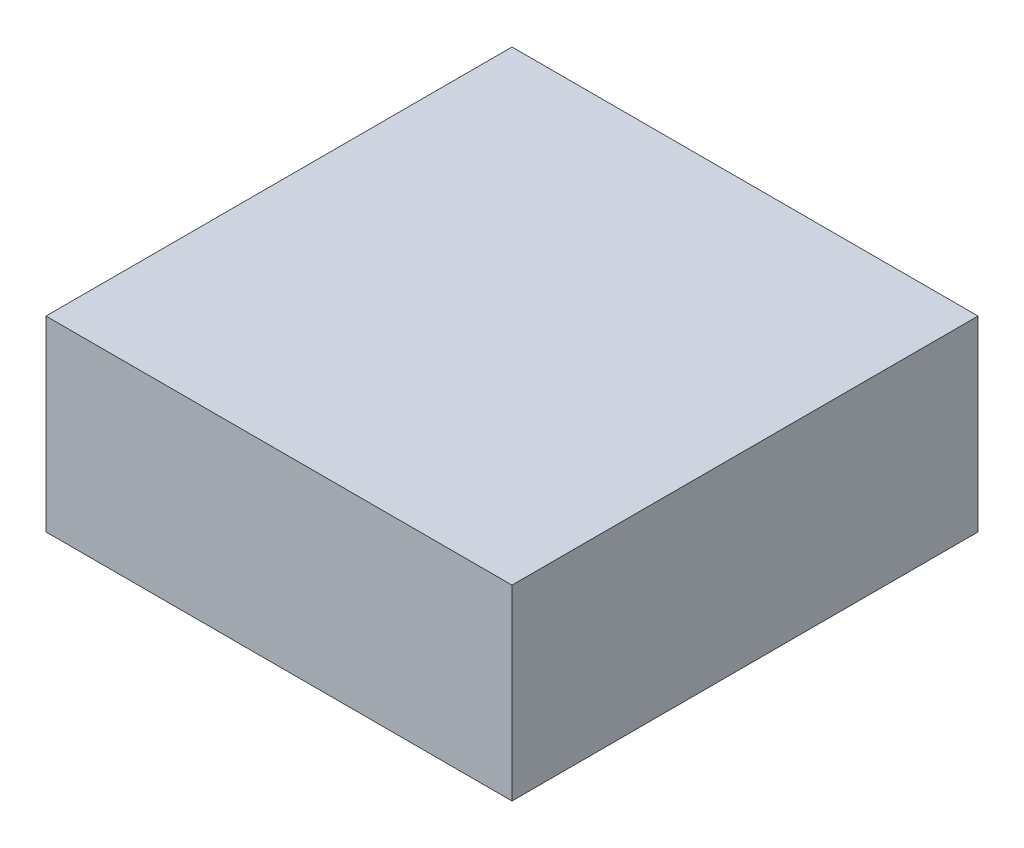
ISO-10303-21;
HEADER;
FILE_DESCRIPTION(('STEP AP214'),'2;1');
FILE_NAME('part.step','',(''),(''),'','','');
FILE_SCHEMA(('AUTOMOTIVE_DESIGN { 1 0 10303 214 1 1 1 1 }'));
ENDSEC;
DATA;
#1=APPLICATION_CONTEXT('core data for automotive mechanical design processes');
#2=APPLICATION_PROTOCOL_DEFINITION('international standard','automotive_design',2000,#1);
#3=PRODUCT_CONTEXT('',#1,'mechanical');
#4=PRODUCT('Part','Part','',(#3));
#5=PRODUCT_RELATED_PRODUCT_CATEGORY('part','',(#4));
#6=PRODUCT_DEFINITION_FORMATION('','',#4);
#7=PRODUCT_DEFINITION_CONTEXT('part definition',#1,'design');
#8=PRODUCT_DEFINITION('design','',#6,#7);
#9=PRODUCT_DEFINITION_SHAPE('','',#8);
#10=(LENGTH_UNIT() NAMED_UNIT(*) SI_UNIT(.MILLI.,.METRE.));
#11=(NAMED_UNIT(*) PLANE_ANGLE_UNIT() SI_UNIT($,.RADIAN.));
#12=(NAMED_UNIT(*) SI_UNIT($,.STERADIAN.) SOLID_ANGLE_UNIT());
#13=UNCERTAINTY_MEASURE_WITH_UNIT(LENGTH_MEASURE(1.E-05),#10,'distance_accuracy_value','');
#14=(GEOMETRIC_REPRESENTATION_CONTEXT(3) GLOBAL_UNCERTAINTY_ASSIGNED_CONTEXT((#13)) GLOBAL_UNIT_ASSIGNED_CONTEXT((#10,
#11,#12)) REPRESENTATION_CONTEXT('',''));
#15=CARTESIAN_POINT('',(0.,0.,0.));
#16=DIRECTION('',(0.,0.,1.));
#17=DIRECTION('',(1.,0.,0.));
#18=AXIS2_PLACEMENT_3D('',#15,#16,#17);
#19=CARTESIAN_POINT('',(3.925,-3.15,-3.925));
#20=DIRECTION('',(1.,0.,0.));
#21=DIRECTION('',(0.,0.,-1.));
#22=AXIS2_PLACEMENT_3D('',#19,#20,#21);
#23=PLANE('',#22);
#24=DIRECTION('',(0.,0.,-1.));
#25=VECTOR('',#24,1.);
#26=CARTESIAN_POINT('',(3.925,0.,-3.925));
#27=LINE('',#26,#25);
#28=CARTESIAN_POINT('',(3.925,0.,3.925));
#29=VERTEX_POINT('',#28);
#30=CARTESIAN_POINT('',(3.925,0.,-3.925));
#31=VERTEX_POINT('',#30);
#32=EDGE_CURVE('E115',#29,#31,#27,.T.);
#33=ORIENTED_EDGE('',*,*,#32,.F.);
#34=DIRECTION('',(0.,1.,0.));
#35=VECTOR('',#34,1.);
#36=CARTESIAN_POINT('',(3.925,-3.15,3.925));
#37=LINE('',#36,#35);
#38=CARTESIAN_POINT('',(3.925,-3.15,3.925));
#39=VERTEX_POINT('',#38);
#40=EDGE_CURVE('E11',#39,#29,#37,.T.);
#41=ORIENTED_EDGE('',*,*,#40,.F.);
#42=DIRECTION('',(0.,0.,-1.));
#43=VECTOR('',#42,1.);
#44=CARTESIAN_POINT('',(3.925,-3.15,-3.925));
#45=LINE('',#44,#43);
#46=CARTESIAN_POINT('',(3.925,-3.15,-3.925));
#47=VERTEX_POINT('',#46);
#48=EDGE_CURVE('E146',#39,#47,#45,.T.);
#49=ORIENTED_EDGE('',*,*,#48,.T.);
#50=DIRECTION('',(0.,1.,0.));
#51=VECTOR('',#50,1.);
#52=CARTESIAN_POINT('',(3.925,-3.15,-3.925));
#53=LINE('',#52,#51);
#54=EDGE_CURVE('E36',#47,#31,#53,.T.);
#55=ORIENTED_EDGE('',*,*,#54,.T.);
#56=EDGE_LOOP('',(#33,#41,#49,#55));
#57=FACE_BOUND('',#56,.T.);
#58=ADVANCED_FACE('F33',(#57),#23,.T.);
#59=CARTESIAN_POINT('',(-3.925,-3.15,3.925));
#60=DIRECTION('',(0.,0.,1.));
#61=DIRECTION('',(1.,0.,0.));
#62=AXIS2_PLACEMENT_3D('',#59,#60,#61);
#63=PLANE('',#62);
#64=DIRECTION('',(1.,0.,0.));
#65=VECTOR('',#64,1.);
#66=CARTESIAN_POINT('',(-3.925,0.,3.925));
#67=LINE('',#66,#65);
#68=CARTESIAN_POINT('',(-3.925,0.,3.925));
#69=VERTEX_POINT('',#68);
#70=EDGE_CURVE('E149',#69,#29,#67,.T.);
#71=ORIENTED_EDGE('',*,*,#70,.F.);
#72=DIRECTION('',(0.,1.,0.));
#73=VECTOR('',#72,1.);
#74=CARTESIAN_POINT('',(-3.925,-3.15,3.925));
#75=LINE('',#74,#73);
#76=CARTESIAN_POINT('',(-3.925,-3.15,3.925));
#77=VERTEX_POINT('',#76);
#78=EDGE_CURVE('E41',#77,#69,#75,.T.);
#79=ORIENTED_EDGE('',*,*,#78,.F.);
#80=DIRECTION('',(1.,0.,0.));
#81=VECTOR('',#80,1.);
#82=CARTESIAN_POINT('',(-3.925,-3.15,3.925));
#83=LINE('',#82,#81);
#84=EDGE_CURVE('E154',#77,#39,#83,.T.);
#85=ORIENTED_EDGE('',*,*,#84,.T.);
#86=ORIENTED_EDGE('',*,*,#40,.T.);
#87=EDGE_LOOP('',(#71,#79,#85,#86));
#88=FACE_BOUND('',#87,.T.);
#89=ADVANCED_FACE('F171',(#88),#63,.T.);
#90=CARTESIAN_POINT('',(-3.925,-3.15,-3.925));
#91=DIRECTION('',(-1.,0.,0.));
#92=DIRECTION('',(0.,0.,1.));
#93=AXIS2_PLACEMENT_3D('',#90,#91,#92);
#94=PLANE('',#93);
#95=DIRECTION('',(0.,0.,1.));
#96=VECTOR('',#95,1.);
#97=CARTESIAN_POINT('',(-3.925,0.,-3.925));
#98=LINE('',#97,#96);
#99=CARTESIAN_POINT('',(-3.925,0.,-3.925));
#100=VERTEX_POINT('',#99);
#101=EDGE_CURVE('E161',#100,#69,#98,.T.);
#102=ORIENTED_EDGE('',*,*,#101,.F.);
#103=DIRECTION('',(0.,1.,0.));
#104=VECTOR('',#103,1.);
#105=CARTESIAN_POINT('',(-3.925,-3.15,-3.925));
#106=LINE('',#105,#104);
#107=CARTESIAN_POINT('',(-3.925,-3.15,-3.925));
#108=VERTEX_POINT('',#107);
#109=EDGE_CURVE('E166',#108,#100,#106,.T.);
#110=ORIENTED_EDGE('',*,*,#109,.F.);
#111=DIRECTION('',(0.,0.,1.));
#112=VECTOR('',#111,1.);
#113=CARTESIAN_POINT('',(-3.925,-3.15,-3.925));
#114=LINE('',#113,#112);
#115=EDGE_CURVE('E151',#108,#77,#114,.T.);
#116=ORIENTED_EDGE('',*,*,#115,.T.);
#117=ORIENTED_EDGE('',*,*,#78,.T.);
#118=EDGE_LOOP('',(#102,#110,#116,#117));
#119=FACE_BOUND('',#118,.T.);
#120=ADVANCED_FACE('F175',(#119),#94,.T.);
#121=CARTESIAN_POINT('',(-3.925,-3.15,-3.925));
#122=DIRECTION('',(0.,0.,-1.));
#123=DIRECTION('',(-1.,0.,0.));
#124=AXIS2_PLACEMENT_3D('',#121,#122,#123);
#125=PLANE('',#124);
#126=DIRECTION('',(-1.,0.,0.));
#127=VECTOR('',#126,1.);
#128=CARTESIAN_POINT('',(-3.925,0.,-3.925));
#129=LINE('',#128,#127);
#130=EDGE_CURVE('E158',#31,#100,#129,.T.);
#131=ORIENTED_EDGE('',*,*,#130,.F.);
#132=ORIENTED_EDGE('',*,*,#54,.F.);
#133=DIRECTION('',(-1.,0.,0.));
#134=VECTOR('',#133,1.);
#135=CARTESIAN_POINT('',(-3.925,-3.15,-3.925));
#136=LINE('',#135,#134);
#137=EDGE_CURVE('E148',#47,#108,#136,.T.);
#138=ORIENTED_EDGE('',*,*,#137,.T.);
#139=ORIENTED_EDGE('',*,*,#109,.T.);
#140=EDGE_LOOP('',(#131,#132,#138,#139));
#141=FACE_BOUND('',#140,.T.);
#142=ADVANCED_FACE('F168',(#141),#125,.T.);
#143=CARTESIAN_POINT('',(0.,-3.15,0.));
#144=DIRECTION('',(0.,1.,0.));
#145=DIRECTION('',(0.,0.,1.));
#146=AXIS2_PLACEMENT_3D('',#143,#144,#145);
#147=PLANE('',#146);
#148=DIRECTION('',(1.,0.,0.));
#149=VECTOR('',#148,1.);
#150=CARTESIAN_POINT('',(0.,-3.15,2.425));
#151=LINE('',#150,#149);
#152=CARTESIAN_POINT('',(-2.425,-3.15,2.425));
#153=VERTEX_POINT('',#152);
#154=CARTESIAN_POINT('',(2.425,-3.15,2.425));
#155=VERTEX_POINT('',#154);
#156=EDGE_CURVE('E141',#153,#155,#151,.T.);
#157=ORIENTED_EDGE('',*,*,#156,.T.);
#158=DIRECTION('',(0.,0.,-1.));
#159=VECTOR('',#158,1.);
#160=CARTESIAN_POINT('',(2.425,-3.15,0.));
#161=LINE('',#160,#159);
#162=CARTESIAN_POINT('',(2.425,-3.15,-2.425));
#163=VERTEX_POINT('',#162);
#164=EDGE_CURVE('E110',#155,#163,#161,.T.);
#165=ORIENTED_EDGE('',*,*,#164,.T.);
#166=DIRECTION('',(-1.,0.,0.));
#167=VECTOR('',#166,1.);
#168=CARTESIAN_POINT('',(0.,-3.15,-2.425));
#169=LINE('',#168,#167);
#170=CARTESIAN_POINT('',(-2.425,-3.15,-2.425));
#171=VERTEX_POINT('',#170);
#172=EDGE_CURVE('E131',#163,#171,#169,.T.);
#173=ORIENTED_EDGE('',*,*,#172,.T.);
#174=DIRECTION('',(0.,0.,1.));
#175=VECTOR('',#174,1.);
#176=CARTESIAN_POINT('',(-2.425,-3.15,0.));
#177=LINE('',#176,#175);
#178=EDGE_CURVE('E49',#171,#153,#177,.T.);
#179=ORIENTED_EDGE('',*,*,#178,.T.);
#180=EDGE_LOOP('',(#157,#165,#173,#179));
#181=FACE_BOUND('',#180,.T.);
#182=ORIENTED_EDGE('',*,*,#48,.F.);
#183=ORIENTED_EDGE('',*,*,#84,.F.);
#184=ORIENTED_EDGE('',*,*,#115,.F.);
#185=ORIENTED_EDGE('',*,*,#137,.F.);
#186=EDGE_LOOP('',(#182,#183,#184,#185));
#187=FACE_BOUND('',#186,.T.);
#188=ADVANCED_FACE('F177',(#181,#187),#147,.F.);
#189=CARTESIAN_POINT('',(0.,0.,0.));
#190=DIRECTION('',(0.,1.,0.));
#191=DIRECTION('',(0.,0.,1.));
#192=AXIS2_PLACEMENT_3D('',#189,#190,#191);
#193=PLANE('',#192);
#194=ORIENTED_EDGE('',*,*,#32,.T.);
#195=ORIENTED_EDGE('',*,*,#130,.T.);
#196=ORIENTED_EDGE('',*,*,#101,.T.);
#197=ORIENTED_EDGE('',*,*,#70,.T.);
#198=EDGE_LOOP('',(#194,#195,#196,#197));
#199=FACE_BOUND('',#198,.T.);
#200=ADVANCED_FACE('F170',(#199),#193,.T.);
#201=CARTESIAN_POINT('',(2.425,-3.15,-3.925));
#202=DIRECTION('',(1.,0.,0.));
#203=DIRECTION('',(0.,0.,-1.));
#204=AXIS2_PLACEMENT_3D('',#201,#202,#203);
#205=PLANE('',#204);
#206=DIRECTION('',(0.,0.,-1.));
#207=VECTOR('',#206,1.);
#208=CARTESIAN_POINT('',(2.425,-1.5,0.));
#209=LINE('',#208,#207);
#210=CARTESIAN_POINT('',(2.425,-1.5,2.425));
#211=VERTEX_POINT('',#210);
#212=CARTESIAN_POINT('',(2.425,-1.5,-2.425));
#213=VERTEX_POINT('',#212);
#214=EDGE_CURVE('E108',#211,#213,#209,.T.);
#215=ORIENTED_EDGE('',*,*,#214,.T.);
#216=DIRECTION('',(0.,1.,0.));
#217=VECTOR('',#216,1.);
#218=CARTESIAN_POINT('',(2.425,-3.15,-2.425));
#219=LINE('',#218,#217);
#220=EDGE_CURVE('E136',#163,#213,#219,.T.);
#221=ORIENTED_EDGE('',*,*,#220,.F.);
#222=ORIENTED_EDGE('',*,*,#164,.F.);
#223=DIRECTION('',(0.,1.,0.));
#224=VECTOR('',#223,1.);
#225=CARTESIAN_POINT('',(2.425,-3.15,2.425));
#226=LINE('',#225,#224);
#227=EDGE_CURVE('E105',#155,#211,#226,.T.);
#228=ORIENTED_EDGE('',*,*,#227,.T.);
#229=EDGE_LOOP('',(#215,#221,#222,#228));
#230=FACE_BOUND('',#229,.T.);
#231=ADVANCED_FACE('F107',(#230),#205,.F.);
#232=CARTESIAN_POINT('',(-3.925,-3.15,2.425));
#233=DIRECTION('',(0.,0.,1.));
#234=DIRECTION('',(1.,0.,0.));
#235=AXIS2_PLACEMENT_3D('',#232,#233,#234);
#236=PLANE('',#235);
#237=DIRECTION('',(1.,0.,0.));
#238=VECTOR('',#237,1.);
#239=CARTESIAN_POINT('',(0.,-1.5,2.425));
#240=LINE('',#239,#238);
#241=CARTESIAN_POINT('',(-2.425,-1.5,2.425));
#242=VERTEX_POINT('',#241);
#243=EDGE_CURVE('E123',#242,#211,#240,.T.);
#244=ORIENTED_EDGE('',*,*,#243,.T.);
#245=ORIENTED_EDGE('',*,*,#227,.F.);
#246=ORIENTED_EDGE('',*,*,#156,.F.);
#247=DIRECTION('',(0.,1.,0.));
#248=VECTOR('',#247,1.);
#249=CARTESIAN_POINT('',(-2.425,-3.15,2.425));
#250=LINE('',#249,#248);
#251=EDGE_CURVE('E116',#153,#242,#250,.T.);
#252=ORIENTED_EDGE('',*,*,#251,.T.);
#253=EDGE_LOOP('',(#244,#245,#246,#252));
#254=FACE_BOUND('',#253,.T.);
#255=ADVANCED_FACE('F127',(#254),#236,.F.);
#256=CARTESIAN_POINT('',(-2.425,-3.15,-3.925));
#257=DIRECTION('',(-1.,0.,0.));
#258=DIRECTION('',(0.,0.,1.));
#259=AXIS2_PLACEMENT_3D('',#256,#257,#258);
#260=PLANE('',#259);
#261=DIRECTION('',(0.,0.,1.));
#262=VECTOR('',#261,1.);
#263=CARTESIAN_POINT('',(-2.425,-1.5,0.));
#264=LINE('',#263,#262);
#265=CARTESIAN_POINT('',(-2.425,-1.5,-2.425));
#266=VERTEX_POINT('',#265);
#267=EDGE_CURVE('E129',#266,#242,#264,.T.);
#268=ORIENTED_EDGE('',*,*,#267,.T.);
#269=ORIENTED_EDGE('',*,*,#251,.F.);
#270=ORIENTED_EDGE('',*,*,#178,.F.);
#271=DIRECTION('',(0.,1.,0.));
#272=VECTOR('',#271,1.);
#273=CARTESIAN_POINT('',(-2.425,-3.15,-2.425));
#274=LINE('',#273,#272);
#275=EDGE_CURVE('E137',#171,#266,#274,.T.);
#276=ORIENTED_EDGE('',*,*,#275,.T.);
#277=EDGE_LOOP('',(#268,#269,#270,#276));
#278=FACE_BOUND('',#277,.T.);
#279=ADVANCED_FACE('F229',(#278),#260,.F.);
#280=CARTESIAN_POINT('',(-3.925,-3.15,-2.425));
#281=DIRECTION('',(0.,0.,-1.));
#282=DIRECTION('',(-1.,0.,0.));
#283=AXIS2_PLACEMENT_3D('',#280,#281,#282);
#284=PLANE('',#283);
#285=DIRECTION('',(-1.,0.,0.));
#286=VECTOR('',#285,1.);
#287=CARTESIAN_POINT('',(0.,-1.5,-2.425));
#288=LINE('',#287,#286);
#289=EDGE_CURVE('E125',#213,#266,#288,.T.);
#290=ORIENTED_EDGE('',*,*,#289,.T.);
#291=ORIENTED_EDGE('',*,*,#275,.F.);
#292=ORIENTED_EDGE('',*,*,#172,.F.);
#293=ORIENTED_EDGE('',*,*,#220,.T.);
#294=EDGE_LOOP('',(#290,#291,#292,#293));
#295=FACE_BOUND('',#294,.T.);
#296=ADVANCED_FACE('F238',(#295),#284,.F.);
#297=CARTESIAN_POINT('',(0.,-1.5,0.));
#298=DIRECTION('',(0.,1.,0.));
#299=DIRECTION('',(0.,0.,1.));
#300=AXIS2_PLACEMENT_3D('',#297,#298,#299);
#301=PLANE('',#300);
#302=ORIENTED_EDGE('',*,*,#214,.F.);
#303=ORIENTED_EDGE('',*,*,#243,.F.);
#304=ORIENTED_EDGE('',*,*,#267,.F.);
#305=ORIENTED_EDGE('',*,*,#289,.F.);
#306=EDGE_LOOP('',(#302,#303,#304,#305));
#307=FACE_BOUND('',#306,.T.);
#308=ADVANCED_FACE('F121',(#307),#301,.F.);
#309=CLOSED_SHELL('',(#58,#89,#120,#142,#188,#200,#231,#255,#279,#296,#308));
#310=MANIFOLD_SOLID_BREP('B2',#309);
#311=ADVANCED_BREP_SHAPE_REPRESENTATION('',(#18,#310),#14);
#312=SHAPE_DEFINITION_REPRESENTATION(#9,#311);
ENDSEC;
END-ISO-10303-21;
